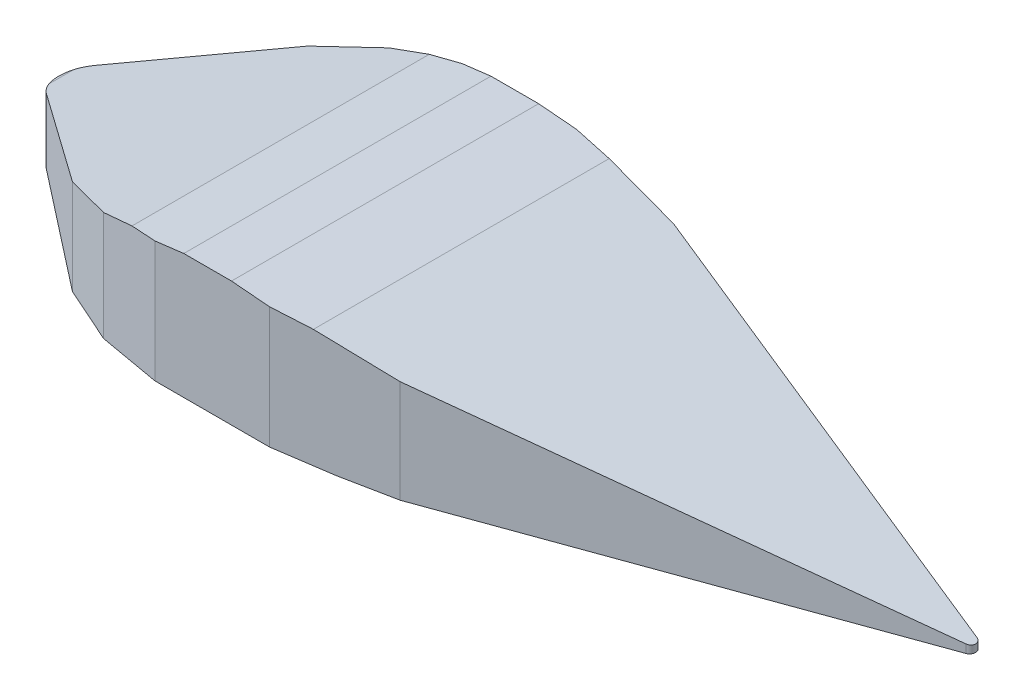
ISO-10303-21;
HEADER;
FILE_DESCRIPTION(('STEP AP214'),'2;1');
FILE_NAME('part.step','',(''),(''),'','','');
FILE_SCHEMA(('AUTOMOTIVE_DESIGN { 1 0 10303 214 1 1 1 1 }'));
ENDSEC;
DATA;
#1=APPLICATION_CONTEXT('core data for automotive mechanical design processes');
#2=APPLICATION_PROTOCOL_DEFINITION('international standard','automotive_design',2000,#1);
#3=PRODUCT_CONTEXT('',#1,'mechanical');
#4=PRODUCT('Part','Part','',(#3));
#5=PRODUCT_RELATED_PRODUCT_CATEGORY('part','',(#4));
#6=PRODUCT_DEFINITION_FORMATION('','',#4);
#7=PRODUCT_DEFINITION_CONTEXT('part definition',#1,'design');
#8=PRODUCT_DEFINITION('design','',#6,#7);
#9=PRODUCT_DEFINITION_SHAPE('','',#8);
#10=(LENGTH_UNIT() NAMED_UNIT(*) SI_UNIT(.MILLI.,.METRE.));
#11=(NAMED_UNIT(*) PLANE_ANGLE_UNIT() SI_UNIT($,.RADIAN.));
#12=(NAMED_UNIT(*) SI_UNIT($,.STERADIAN.) SOLID_ANGLE_UNIT());
#13=UNCERTAINTY_MEASURE_WITH_UNIT(LENGTH_MEASURE(1.E-05),#10,'distance_accuracy_value','');
#14=(GEOMETRIC_REPRESENTATION_CONTEXT(3) GLOBAL_UNCERTAINTY_ASSIGNED_CONTEXT((#13)) GLOBAL_UNIT_ASSIGNED_CONTEXT((#10,
#11,#12)) REPRESENTATION_CONTEXT('',''));
#15=CARTESIAN_POINT('',(0.,0.,0.));
#16=DIRECTION('',(0.,0.,1.));
#17=DIRECTION('',(1.,0.,0.));
#18=AXIS2_PLACEMENT_3D('',#15,#16,#17);
#19=CARTESIAN_POINT('',(1401.451,800.,-800.));
#20=DIRECTION('',(0.,0.,1.));
#21=DIRECTION('',(1.,0.,0.));
#22=AXIS2_PLACEMENT_3D('',#19,#20,#21);
#23=PLANE('',#22);
#24=DIRECTION('',(-0.992522376322293,-0.122062821938327,0.));
#25=VECTOR('',#24,1.);
#26=CARTESIAN_POINT('',(1255.921,763.655,-800.));
#27=LINE('',#26,#25);
#28=CARTESIAN_POINT('',(1551.451,800.,-800.));
#29=VERTEX_POINT('',#28);
#30=CARTESIAN_POINT('',(1401.451,781.55263425033,-800.));
#31=VERTEX_POINT('',#30);
#32=EDGE_CURVE('E665',#29,#31,#27,.T.);
#33=ORIENTED_EDGE('',*,*,#32,.F.);
#34=DIRECTION('',(-1.,0.,0.));
#35=VECTOR('',#34,1.);
#36=CARTESIAN_POINT('',(1401.451,800.,-800.));
#37=LINE('',#36,#35);
#38=CARTESIAN_POINT('',(1800.,800.,-800.));
#39=VERTEX_POINT('',#38);
#40=EDGE_CURVE('E214',#39,#29,#37,.T.);
#41=ORIENTED_EDGE('',*,*,#40,.F.);
#42=DIRECTION('',(-0.996313130885577,0.0857912887476274,0.));
#43=VECTOR('',#42,1.);
#44=CARTESIAN_POINT('',(1800.,800.,-800.));
#45=LINE('',#44,#43);
#46=CARTESIAN_POINT('',(1997.019,783.03493811956,-800.));
#47=VERTEX_POINT('',#46);
#48=EDGE_CURVE('E485',#47,#39,#45,.T.);
#49=ORIENTED_EDGE('',*,*,#48,.F.);
#50=DIRECTION('',(0.,-1.,0.));
#51=VECTOR('',#50,1.);
#52=CARTESIAN_POINT('',(1997.019,800.,-800.));
#53=LINE('',#52,#51);
#54=CARTESIAN_POINT('',(1997.019,150.,-800.));
#55=VERTEX_POINT('',#54);
#56=EDGE_CURVE('E245',#47,#55,#53,.T.);
#57=ORIENTED_EDGE('',*,*,#56,.T.);
#58=DIRECTION('',(1.,0.,0.));
#59=VECTOR('',#58,1.);
#60=CARTESIAN_POINT('',(2301.451,150.,-800.));
#61=LINE('',#60,#59);
#62=CARTESIAN_POINT('',(1401.45099999999,150.,-800.));
#63=VERTEX_POINT('',#62);
#64=EDGE_CURVE('E657',#63,#55,#61,.T.);
#65=ORIENTED_EDGE('',*,*,#64,.F.);
#66=DIRECTION('',(0.,-1.,0.));
#67=VECTOR('',#66,1.);
#68=CARTESIAN_POINT('',(1401.451,800.,-800.));
#69=LINE('',#68,#67);
#70=EDGE_CURVE('E236',#31,#63,#69,.T.);
#71=ORIENTED_EDGE('',*,*,#70,.F.);
#72=EDGE_LOOP('',(#33,#41,#49,#57,#65,#71));
#73=FACE_BOUND('',#72,.T.);
#74=ADVANCED_FACE('F46',(#73),#23,.F.);
#75=CARTESIAN_POINT('',(784.13,800.,-612.54));
#76=DIRECTION('',(0.406737992749078,0.,0.913544856728147));
#77=DIRECTION('',(0.913544856728147,0.,-0.406737992749078));
#78=AXIS2_PLACEMENT_3D('',#75,#76,#77);
#79=PLANE('',#78);
#80=DIRECTION('',(0.913544856728147,0.,-0.406737992749078));
#81=VECTOR('',#80,1.);
#82=CARTESIAN_POINT('',(784.13,150.,-612.54));
#83=LINE('',#82,#81);
#84=CARTESIAN_POINT('',(784.13,150.,-612.54));
#85=VERTEX_POINT('',#84);
#86=CARTESIAN_POINT('',(1076.464,150.,-742.696));
#87=VERTEX_POINT('',#86);
#88=EDGE_CURVE('E401',#85,#87,#83,.T.);
#89=ORIENTED_EDGE('',*,*,#88,.F.);
#90=DIRECTION('',(0.,-1.,0.));
#91=VECTOR('',#90,1.);
#92=CARTESIAN_POINT('',(784.13,800.,-612.54));
#93=LINE('',#92,#91);
#94=CARTESIAN_POINT('',(784.13,645.829431269961,-612.54));
#95=VERTEX_POINT('',#94);
#96=EDGE_CURVE('E284',#95,#85,#93,.T.);
#97=ORIENTED_EDGE('',*,*,#96,.F.);
#98=DIRECTION('',(-0.890658508940707,-0.222433970466134,0.396548293697233));
#99=VECTOR('',#98,1.);
#100=CARTESIAN_POINT('',(814.673148937951,653.457308644519,-626.138740116332));
#101=LINE('',#100,#99);
#102=CARTESIAN_POINT('',(1076.464,718.837224570654,-742.696));
#103=VERTEX_POINT('',#102);
#104=EDGE_CURVE('E220',#103,#95,#101,.T.);
#105=ORIENTED_EDGE('',*,*,#104,.F.);
#106=DIRECTION('',(0.,-1.,0.));
#107=VECTOR('',#106,1.);
#108=CARTESIAN_POINT('',(1076.464,800.,-742.696));
#109=LINE('',#108,#107);
#110=EDGE_CURVE('E228',#103,#87,#109,.T.);
#111=ORIENTED_EDGE('',*,*,#110,.T.);
#112=EDGE_LOOP('',(#89,#97,#105,#111));
#113=FACE_BOUND('',#112,.T.);
#114=ADVANCED_FACE('F48',(#113),#79,.F.);
#115=CARTESIAN_POINT('',(161.409759474516,800.,-126.088702215857));
#116=DIRECTION('',(0.615605620682322,0.,0.788054388849103));
#117=DIRECTION('',(0.788054388849103,0.,-0.615605620682322));
#118=AXIS2_PLACEMENT_3D('',#115,#116,#117);
#119=PLANE('',#118);
#120=DIRECTION('',(0.788054388849103,0.,-0.615605620682322));
#121=VECTOR('',#120,1.);
#122=CARTESIAN_POINT('',(161.409759474516,150.,-126.088702215857));
#123=LINE('',#122,#121);
#124=CARTESIAN_POINT('',(161.409759474516,150.,-126.088702215857));
#125=VERTEX_POINT('',#124);
#126=EDGE_CURVE('E406',#125,#85,#123,.T.);
#127=ORIENTED_EDGE('',*,*,#126,.F.);
#128=DIRECTION('',(0.,-1.,0.));
#129=VECTOR('',#128,1.);
#130=CARTESIAN_POINT('',(161.409759474516,800.,-126.088702215857));
#131=LINE('',#130,#129);
#132=CARTESIAN_POINT('',(161.409759474516,490.310639051325,-126.088702215857));
#133=VERTEX_POINT('',#132);
#134=EDGE_CURVE('E281',#133,#125,#131,.T.);
#135=ORIENTED_EDGE('',*,*,#134,.F.);
#136=DIRECTION('',(-0.773221678679863,-0.193105175903845,0.604018730387262));
#137=VECTOR('',#136,1.);
#138=CARTESIAN_POINT('',(207.650440557195,501.858834220438,-162.210603929074));
#139=LINE('',#138,#137);
#140=EDGE_CURVE('E484',#95,#133,#139,.T.);
#141=ORIENTED_EDGE('',*,*,#140,.F.);
#142=ORIENTED_EDGE('',*,*,#96,.T.);
#143=EDGE_LOOP('',(#127,#135,#141,#142));
#144=FACE_BOUND('',#143,.T.);
#145=ADVANCED_FACE('F373',(#144),#119,.F.);
#146=CARTESIAN_POINT('',(259.906658783687,800.,0.));
#147=DIRECTION('',(0.,-1.,0.));
#148=DIRECTION('',(0.,0.,-1.));
#149=AXIS2_PLACEMENT_3D('',#146,#147,#148);
#150=CYLINDRICAL_SURFACE('',#149,160.);
#151=CARTESIAN_POINT('',(259.906658783687,150.,0.));
#152=DIRECTION('',(0.,-1.,0.));
#153=DIRECTION('',(0.,0.,-1.));
#154=AXIS2_PLACEMENT_3D('',#151,#152,#153);
#155=CIRCLE('',#154,160.);
#156=CARTESIAN_POINT('',(150.000000000001,150.,-116.277798203296));
#157=VERTEX_POINT('',#156);
#158=EDGE_CURVE('E408',#157,#125,#155,.T.);
#159=ORIENTED_EDGE('',*,*,#158,.F.);
#160=CARTESIAN_POINT('',(150.000000000001,150.,116.277798203296));
#161=CARTESIAN_POINT('',(149.197227518989,150.000000444739,115.519013001235));
#162=CARTESIAN_POINT('',(148.402349323818,150.006444551494,114.751945115754));
#163=CARTESIAN_POINT('',(146.828761077163,150.031461689993,113.201629596887));
#164=CARTESIAN_POINT('',(146.050050642099,150.050034433644,112.418382348238));
#165=CARTESIAN_POINT('',(143.738992605804,150.122798834219,110.04521254094));
#166=CARTESIAN_POINT('',(142.231396084721,150.194037269926,108.43155736251));
#167=CARTESIAN_POINT('',(139.286546373213,150.375814699117,105.145862331909));
#168=CARTESIAN_POINT('',(137.849239225862,150.486322991144,103.473869007217));
#169=CARTESIAN_POINT('',(135.046053340974,150.740627964951,100.073395601841));
#170=CARTESIAN_POINT('',(133.680177219111,150.884425864692,98.3449134563995));
#171=CARTESIAN_POINT('',(131.02300306583,151.199252798717,94.8358771461096));
#172=CARTESIAN_POINT('',(129.731654200361,151.37026296545,93.0553597529596));
#173=CARTESIAN_POINT('',(127.224251842487,151.733785604688,89.4439038255724));
#174=CARTESIAN_POINT('',(126.008207640174,151.926300722009,87.6129591103741));
#175=CARTESIAN_POINT('',(123.653075843413,152.327163170553,83.9034496690219));
#176=CARTESIAN_POINT('',(122.514002675644,152.535513454298,82.0248761060327));
#177=CARTESIAN_POINT('',(120.314753352958,152.962451132073,78.2235331504458));
#178=CARTESIAN_POINT('',(119.254568306852,153.181037367909,76.3007687705009));
#179=CARTESIAN_POINT('',(117.216364660646,153.622684269366,72.4173979297616));
#180=CARTESIAN_POINT('',(116.238193444443,153.84573562226,70.4568704991597));
#181=CARTESIAN_POINT('',(114.363161419552,154.291577394139,66.4972847107506));
#182=CARTESIAN_POINT('',(113.466300511938,154.514367813441,64.498226399826));
#183=CARTESIAN_POINT('',(111.755279479412,154.954759642745,60.4646006807219));
#184=CARTESIAN_POINT('',(110.941114441265,155.172361360436,58.4300353905561));
#185=CARTESIAN_POINT('',(109.396721623775,155.597730716471,54.3282724139932));
#186=CARTESIAN_POINT('',(108.666493845212,155.805498354724,52.2610747272925));
#187=CARTESIAN_POINT('',(107.291517437633,156.206751675774,48.0980446572107));
#188=CARTESIAN_POINT('',(106.646732773703,156.400243363975,46.002224759014));
#189=CARTESIAN_POINT('',(105.443470641596,156.769026649784,41.7843631491049));
#190=CARTESIAN_POINT('',(104.884993033116,156.944318276979,39.6623214800256));
#191=CARTESIAN_POINT('',(103.855447732851,157.273084547455,35.3954250788465));
#192=CARTESIAN_POINT('',(103.384381074604,157.426558932767,33.2505700773214));
#193=CARTESIAN_POINT('',(102.530668116976,157.708522147084,28.9416891731521));
#194=CARTESIAN_POINT('',(102.148022100941,157.837010896023,26.7776632090972));
#195=CARTESIAN_POINT('',(101.465667462758,158.068499170636,22.3934355301932));
#196=CARTESIAN_POINT('',(101.16765188495,158.170974528566,20.1729421971747));
#197=CARTESIAN_POINT('',(100.665032437988,158.345025688777,15.7201891996206));
#198=CARTESIAN_POINT('',(100.460428869546,158.416601391587,13.4879294972302));
#199=CARTESIAN_POINT('',(100.145158117363,158.527307591483,9.01595322708889));
#200=CARTESIAN_POINT('',(100.034491923749,158.566437746585,6.77623658098936));
#201=CARTESIAN_POINT('',(99.9073913706491,158.611403854638,2.29379848782876));
#202=CARTESIAN_POINT('',(99.8909568527162,158.617239863573,0.051077045826518));
#203=CARTESIAN_POINT('',(99.9523649444746,158.595490600866,-4.43306367901725));
#204=CARTESIAN_POINT('',(100.030213962676,158.567903057404,-6.67448286298269));
#205=CARTESIAN_POINT('',(100.279994263522,158.479900598214,-11.1514286514722));
#206=CARTESIAN_POINT('',(100.451925825091,158.419485585162,-13.3869552385069));
#207=CARTESIAN_POINT('',(100.889419452544,158.267136953808,-17.8476868417839));
#208=CARTESIAN_POINT('',(101.154979400206,158.175204048558,-20.0728920903795));
#209=CARTESIAN_POINT('',(101.779063595891,157.961800844771,-24.5087784389172));
#210=CARTESIAN_POINT('',(102.137587017684,157.840330808752,-26.7194596677651));
#211=CARTESIAN_POINT('',(102.926775780276,157.577123600622,-31.013612685877));
#212=CARTESIAN_POINT('',(103.353010132429,157.436681731273,-33.0979803235239));
#213=CARTESIAN_POINT('',(104.287844992139,157.134188084224,-37.2465553021804));
#214=CARTESIAN_POINT('',(104.796444743854,156.972136504832,-39.3107628280092));
#215=CARTESIAN_POINT('',(105.895018848793,156.629565097021,-43.4157709760834));
#216=CARTESIAN_POINT('',(106.484990458811,156.449045891235,-45.456572384884));
#217=CARTESIAN_POINT('',(107.745269602171,156.073038938233,-49.5118169088476));
#218=CARTESIAN_POINT('',(108.415577358716,155.87755114943,-51.5262599507603));
#219=CARTESIAN_POINT('',(109.835448832084,155.475423435206,-55.5259909350782));
#220=CARTESIAN_POINT('',(110.585016389714,155.268782969582,-57.5112774592898));
#221=CARTESIAN_POINT('',(112.162222998921,154.848463183412,-61.449830452093));
#222=CARTESIAN_POINT('',(112.989862077778,154.634783860406,-63.4030969094954));
#223=CARTESIAN_POINT('',(114.722056314859,154.204722154663,-67.2750290342799));
#224=CARTESIAN_POINT('',(115.626615162842,153.988339642681,-69.1936930364624));
#225=CARTESIAN_POINT('',(117.511377819577,153.557438268491,-72.9937124329083));
#226=CARTESIAN_POINT('',(118.491581457163,153.342919402067,-74.8750679115794));
#227=CARTESIAN_POINT('',(120.50777368734,152.924342060301,-78.5639102097275));
#228=CARTESIAN_POINT('',(121.542417530248,152.72016412512,-80.3721185349167));
#229=CARTESIAN_POINT('',(123.6821993027,152.32279256364,-83.9478298250324));
#230=CARTESIAN_POINT('',(124.787344283253,152.129600039688,-85.71532869436));
#231=CARTESIAN_POINT('',(127.066448812287,151.759031112758,-89.2066346063972));
#232=CARTESIAN_POINT('',(128.240395586125,151.581651789015,-90.9304496754102));
#233=CARTESIAN_POINT('',(130.655656175891,151.247580067016,-94.3320138856592));
#234=CARTESIAN_POINT('',(131.896962496125,151.090885373631,-96.0097681213313));
#235=CARTESIAN_POINT('',(134.446592080054,150.803019950715,-99.3183641400929));
#236=CARTESIAN_POINT('',(135.754977031147,150.671873267667,-100.949160506855));
#237=CARTESIAN_POINT('',(138.435759352656,150.44038541193,-104.159463428637));
#238=CARTESIAN_POINT('',(139.808154676331,150.340043255038,-105.73897162087));
#239=CARTESIAN_POINT('',(142.615869629207,150.1752575045,-108.845099188879));
#240=CARTESIAN_POINT('',(144.051233647807,150.110839688822,-110.371679851087));
#241=CARTESIAN_POINT('',(146.981580403563,150.023207631752,-113.368082399426));
#242=CARTESIAN_POINT('',(148.476570551278,149.999998528351,-114.83789718552));
#243=CARTESIAN_POINT('',(150.000000000001,150.,-116.277798203296));
#244=B_SPLINE_CURVE_WITH_KNOTS('',3,(#160,#161,#162,#163,#164,#165,#166,#167,#168,#169,#170,
#171,#172,#173,#174,#175,#176,#177,#178,#179,#180,#181,#182,#183,#184,#185,#186,#187,#188,#189,
#190,#191,#192,#193,#194,#195,#196,#197,#198,#199,#200,#201,#202,#203,#204,#205,#206,#207,#208,
#209,#210,#211,#212,#213,#214,#215,#216,#217,#218,#219,#220,#221,#222,#223,#224,#225,#226,#227,
#228,#229,#230,#231,#232,#233,#234,#235,#236,#237,#238,#239,#240,#241,#242,#243),.UNSPECIFIED.,
.F.,.F.,(4,2,2,2,2,2,2,2,2,2,2,2,2,2,2,2,2,2,2,2,2,2,2,2,2,2,2,2,2,2,2,2,2,2,2,2,2,2,2,2,2,4),
(0.,3.31371001652173,6.6273413252177,13.2532751900696,19.8740402078592,26.4950474965281,
33.1114839710404,39.728735074476,46.347223028574,52.9649639039096,59.5701033647876,
66.1752347893619,72.7799735513202,79.3847123747203,85.9866567792445,92.588590451293,
99.190602178882,105.792635062469,112.518689760156,119.244766110194,125.970913354142,
132.697049288266,139.42364242767,146.150255509359,152.876716419738,159.603117549501,
165.997719115792,172.392262004003,178.786589372256,185.180934506686,191.575589643311,
197.970247014478,204.3652113037,210.76016112315,217.038388778441,223.317245323713,
229.59493972496,235.871936978217,242.154814065332,248.437490393973,254.724669155171,
261.012631760362),.UNSPECIFIED.);
#245=CARTESIAN_POINT('',(150.000000000001,150.,116.277798203296));
#246=VERTEX_POINT('',#245);
#247=EDGE_CURVE('E12',#246,#157,#244,.T.);
#248=ORIENTED_EDGE('',*,*,#247,.F.);
#249=CARTESIAN_POINT('',(161.409759474516,150.,126.088702215857));
#250=VERTEX_POINT('',#249);
#251=EDGE_CURVE('E382',#250,#246,#155,.T.);
#252=ORIENTED_EDGE('',*,*,#251,.F.);
#253=DIRECTION('',(0.,-1.,0.));
#254=VECTOR('',#253,1.);
#255=CARTESIAN_POINT('',(161.409759474516,800.,126.088702215857));
#256=LINE('',#255,#254);
#257=CARTESIAN_POINT('',(161.409759474516,490.310639051325,126.088702215857));
#258=VERTEX_POINT('',#257);
#259=EDGE_CURVE('E280',#258,#250,#256,.T.);
#260=ORIENTED_EDGE('',*,*,#259,.F.);
#261=CARTESIAN_POINT('',(259.906658783687,514.909355812027,0.));
#262=DIRECTION('',(-0.242299141310606,0.970201590454346,0.));
#263=DIRECTION('',(-0.970201590454346,-0.242299141310606,0.));
#264=AXIS2_PLACEMENT_3D('',#261,#262,#263);
#265=ELLIPSE('',#264,164.914180283988,160.);
#266=CARTESIAN_POINT('',(113.655128803409,478.384348557619,64.8882884535251));
#267=VERTEX_POINT('',#266);
#268=EDGE_CURVE('E400',#267,#258,#265,.T.);
#269=ORIENTED_EDGE('',*,*,#268,.F.);
#270=CARTESIAN_POINT('',(113.655128803409,478.384348557619,-64.8882884535262));
#271=CARTESIAN_POINT('',(112.773939032918,478.164232994411,-62.9022135519064));
#272=CARTESIAN_POINT('',(111.933155729284,477.945795953747,-60.8980057661391));
#273=CARTESIAN_POINT('',(110.333625202496,477.516710712539,-56.8562236105315));
#274=CARTESIAN_POINT('',(109.574880662755,477.306062766917,-54.8186481517732));
#275=CARTESIAN_POINT('',(108.140474526136,476.896935722458,-50.7124900371555));
#276=CARTESIAN_POINT('',(107.464840130629,476.698460618308,-48.6438974768202));
#277=CARTESIAN_POINT('',(106.198137658814,476.317814583301,-44.4795123289952));
#278=CARTESIAN_POINT('',(105.607068680471,476.135643478542,-42.3837200318979));
#279=CARTESIAN_POINT('',(104.511164120193,475.791492586405,-38.170326894472));
#280=CARTESIAN_POINT('',(104.006242210099,475.629492630005,-36.0527501682851));
#281=CARTESIAN_POINT('',(103.082932209994,475.328755377082,-31.7971598743901));
#282=CARTESIAN_POINT('',(102.66454431668,475.190018133439,-29.6591462602389));
#283=CARTESIAN_POINT('',(101.915268820844,474.938644041753,-25.3666448290491));
#284=CARTESIAN_POINT('',(101.58436782491,474.826003198927,-23.2121595856825));
#285=CARTESIAN_POINT('',(101.010740244002,474.629088177567,-18.8901866979925));
#286=CARTESIAN_POINT('',(100.768013552683,474.544813964819,-16.7226990693543));
#287=CARTESIAN_POINT('',(100.37076423608,474.406161867699,-12.3726224328995));
#288=CARTESIAN_POINT('',(100.21648827366,474.351867603903,-10.1900082088244));
#289=CARTESIAN_POINT('',(99.9975671230744,474.274653761924,-5.8197269539753));
#290=CARTESIAN_POINT('',(99.9329221235671,474.251734249778,-3.63205991257581));
#291=CARTESIAN_POINT('',(99.8934242819723,474.237742403755,0.744450738233989));
#292=CARTESIAN_POINT('',(99.9185822486836,474.246673903504,2.93329445756778));
#293=CARTESIAN_POINT('',(100.05865020922,474.296207977458,7.30773390133306));
#294=CARTESIAN_POINT('',(100.173559683034,474.336810368165,9.49332964450948));
#295=CARTESIAN_POINT('',(100.492693380218,474.448796061191,13.8551440212281));
#296=CARTESIAN_POINT('',(100.696834271621,474.520150643601,16.0313694952312));
#297=CARTESIAN_POINT('',(101.193919943739,474.692171407193,20.3725274347643));
#298=CARTESIAN_POINT('',(101.486866629951,474.792838217324,22.5374596569623));
#299=CARTESIAN_POINT('',(102.16078590948,475.021392150112,26.8515295793954));
#300=CARTESIAN_POINT('',(102.541734866669,475.149271963028,29.0006713610749));
#301=CARTESIAN_POINT('',(103.390811659426,475.429645345374,33.2798357862657));
#302=CARTESIAN_POINT('',(103.8589325439,475.582136952128,35.4098599400322));
#303=CARTESIAN_POINT('',(104.936939869616,475.926381416005,39.8776210107061));
#304=CARTESIAN_POINT('',(105.556701493798,476.120599632764,42.2127912998076));
#305=CARTESIAN_POINT('',(106.900536974426,476.5305848942,46.8503359801782));
#306=CARTESIAN_POINT('',(107.624586121608,476.746346830732,49.1527179985066));
#307=CARTESIAN_POINT('',(109.174416422244,477.193713901137,53.7177097487012));
#308=CARTESIAN_POINT('',(110.000046911566,477.425295350108,55.980372828677));
#309=CARTESIAN_POINT('',(111.314153213711,477.78033591011,59.3440574899914));
#310=CARTESIAN_POINT('',(111.764862264654,477.899976882307,60.4603772225235));
#311=CARTESIAN_POINT('',(112.691287391965,478.141029180627,62.6823991134768));
#312=CARTESIAN_POINT('',(113.167003475439,478.262440507252,63.7881012688804));
#313=CARTESIAN_POINT('',(113.655128803409,478.384348557619,64.8882884535262));
#314=B_SPLINE_CURVE_WITH_KNOTS('',3,(#270,#271,#272,#273,#274,#275,#276,#277,#278,#279,#280,
#281,#282,#283,#284,#285,#286,#287,#288,#289,#290,#291,#292,#293,#294,#295,#296,#297,#298,#299,
#300,#301,#302,#303,#304,#305,#306,#307,#308,#309,#310,#311,#312,#313),.UNSPECIFIED.,.F.,.F.,(4,
2,2,2,2,2,2,2,2,2,2,2,2,2,2,2,2,2,2,2,2,4),(0.,6.55129299468969,13.1028002115111,
19.6564460177392,26.2100219127685,32.7569913826109,39.3039757340479,45.849957223369,
52.395930817664,58.9600714939325,65.5242259865693,72.0891705757979,78.654077128723,
85.2128658627704,91.7717953380147,98.3289652243588,104.885612465355,112.154383970393,
119.421436080517,126.677836867381,130.306981102657,133.936126369311),.UNSPECIFIED.);
#315=CARTESIAN_POINT('',(113.655128803409,478.384348557619,-64.8882884535256));
#316=VERTEX_POINT('',#315);
#317=EDGE_CURVE('E61',#316,#267,#314,.T.);
#318=ORIENTED_EDGE('',*,*,#317,.F.);
#319=EDGE_CURVE('E397',#133,#316,#265,.T.);
#320=ORIENTED_EDGE('',*,*,#319,.F.);
#321=ORIENTED_EDGE('',*,*,#134,.T.);
#322=EDGE_LOOP('',(#159,#248,#252,#260,#269,#318,#320,#321));
#323=FACE_BOUND('',#322,.T.);
#324=ADVANCED_FACE('F315',(#323),#150,.T.);
#325=CARTESIAN_POINT('',(784.13,800.,612.54));
#326=DIRECTION('',(0.615605620682322,0.,-0.788054388849103));
#327=DIRECTION('',(-0.788054388849103,0.,-0.615605620682322));
#328=AXIS2_PLACEMENT_3D('',#325,#326,#327);
#329=PLANE('',#328);
#330=DIRECTION('',(-0.788054388849103,0.,-0.615605620682322));
#331=VECTOR('',#330,1.);
#332=CARTESIAN_POINT('',(784.13,150.,612.54));
#333=LINE('',#332,#331);
#334=CARTESIAN_POINT('',(784.13,150.,612.54));
#335=VERTEX_POINT('',#334);
#336=EDGE_CURVE('E380',#335,#250,#333,.T.);
#337=ORIENTED_EDGE('',*,*,#336,.F.);
#338=DIRECTION('',(0.,-1.,0.));
#339=VECTOR('',#338,1.);
#340=CARTESIAN_POINT('',(784.13,800.,612.54));
#341=LINE('',#340,#339);
#342=CARTESIAN_POINT('',(784.13,645.82943126996,612.54));
#343=VERTEX_POINT('',#342);
#344=EDGE_CURVE('E272',#343,#335,#341,.T.);
#345=ORIENTED_EDGE('',*,*,#344,.F.);
#346=DIRECTION('',(0.773221678679863,0.193105175903845,0.604018730387262));
#347=VECTOR('',#346,1.);
#348=CARTESIAN_POINT('',(807.149686821474,651.578391491176,630.522323040345));
#349=LINE('',#348,#347);
#350=EDGE_CURVE('E395',#258,#343,#349,.T.);
#351=ORIENTED_EDGE('',*,*,#350,.F.);
#352=ORIENTED_EDGE('',*,*,#259,.T.);
#353=EDGE_LOOP('',(#337,#345,#351,#352));
#354=FACE_BOUND('',#353,.T.);
#355=ADVANCED_FACE('F368',(#354),#329,.F.);
#356=CARTESIAN_POINT('',(1076.464,800.,742.696));
#357=DIRECTION('',(0.406737992749078,0.,-0.913544856728147));
#358=DIRECTION('',(-0.913544856728147,0.,-0.406737992749078));
#359=AXIS2_PLACEMENT_3D('',#356,#357,#358);
#360=PLANE('',#359);
#361=DIRECTION('',(-0.913544856728147,0.,-0.406737992749078));
#362=VECTOR('',#361,1.);
#363=CARTESIAN_POINT('',(1076.464,150.,742.696));
#364=LINE('',#363,#362);
#365=CARTESIAN_POINT('',(1076.464,150.,742.696));
#366=VERTEX_POINT('',#365);
#367=EDGE_CURVE('E383',#366,#335,#364,.T.);
#368=ORIENTED_EDGE('',*,*,#367,.F.);
#369=DIRECTION('',(0.,-1.,0.));
#370=VECTOR('',#369,1.);
#371=CARTESIAN_POINT('',(1076.464,800.,742.696));
#372=LINE('',#371,#370);
#373=CARTESIAN_POINT('',(1076.464,718.837224570654,742.696));
#374=VERTEX_POINT('',#373);
#375=EDGE_CURVE('E267',#374,#366,#372,.T.);
#376=ORIENTED_EDGE('',*,*,#375,.F.);
#377=DIRECTION('',(0.890658508940707,0.222433970466134,0.396548293697233));
#378=VECTOR('',#377,1.);
#379=CARTESIAN_POINT('',(1092.5433772675,722.852904758212,749.85502846617));
#380=LINE('',#379,#378);
#381=EDGE_CURVE('E386',#343,#374,#380,.T.);
#382=ORIENTED_EDGE('',*,*,#381,.F.);
#383=ORIENTED_EDGE('',*,*,#344,.T.);
#384=EDGE_LOOP('',(#368,#376,#382,#383));
#385=FACE_BOUND('',#384,.T.);
#386=ADVANCED_FACE('F361',(#385),#360,.F.);
#387=CARTESIAN_POINT('',(1401.451,800.,800.));
#388=DIRECTION('',(0.173648246791891,0.,-0.98480774082361));
#389=DIRECTION('',(-0.98480774082361,0.,-0.173648246791891));
#390=AXIS2_PLACEMENT_3D('',#387,#388,#389);
#391=PLANE('',#390);
#392=DIRECTION('',(-0.98480774082361,0.,-0.173648246791891));
#393=VECTOR('',#392,1.);
#394=CARTESIAN_POINT('',(1401.451,150.,800.));
#395=LINE('',#394,#393);
#396=CARTESIAN_POINT('',(1401.451,150.,800.));
#397=VERTEX_POINT('',#396);
#398=EDGE_CURVE('E416',#397,#366,#395,.T.);
#399=ORIENTED_EDGE('',*,*,#398,.F.);
#400=DIRECTION('',(0.,-1.,0.));
#401=VECTOR('',#400,1.);
#402=CARTESIAN_POINT('',(1401.451,800.,800.));
#403=LINE('',#402,#401);
#404=CARTESIAN_POINT('',(1401.451,781.55263425033,800.));
#405=VERTEX_POINT('',#404);
#406=EDGE_CURVE('E266',#405,#397,#403,.T.);
#407=ORIENTED_EDGE('',*,*,#406,.F.);
#408=DIRECTION('',(0.977663361324776,0.120235424042734,0.172388499408761));
#409=VECTOR('',#408,1.);
#410=CARTESIAN_POINT('',(1403.61948357921,781.819319648382,800.382362319179));
#411=LINE('',#410,#409);
#412=CARTESIAN_POINT('',(1255.921,763.655,774.339123964959));
#413=VERTEX_POINT('',#412);
#414=EDGE_CURVE('E199',#413,#405,#411,.T.);
#415=ORIENTED_EDGE('',*,*,#414,.F.);
#416=DIRECTION('',(0.956308883695465,0.238829562460936,0.168623127298276));
#417=VECTOR('',#416,1.);
#418=CARTESIAN_POINT('',(1401.45104302586,799.999822361657,800.000007586622));
#419=LINE('',#418,#417);
#420=EDGE_CURVE('E392',#374,#413,#419,.T.);
#421=ORIENTED_EDGE('',*,*,#420,.F.);
#422=ORIENTED_EDGE('',*,*,#375,.T.);
#423=EDGE_LOOP('',(#399,#407,#415,#421,#422));
#424=FACE_BOUND('',#423,.T.);
#425=ADVANCED_FACE('F360',(#424),#391,.F.);
#426=CARTESIAN_POINT('',(2590.582,800.,712.35));
#427=DIRECTION('',(-0.146083423120088,0.,-0.989272274699699));
#428=DIRECTION('',(-0.989272274699699,0.,0.146083423120088));
#429=AXIS2_PLACEMENT_3D('',#426,#427,#428);
#430=PLANE('',#429);
#431=DIRECTION('',(0.985702371591284,-0.0848776094170749,-0.145556264238128));
#432=VECTOR('',#431,1.);
#433=CARTESIAN_POINT('',(2584.88648237212,732.414397887696,713.191043191849));
#434=LINE('',#433,#432);
#435=CARTESIAN_POINT('',(1997.019,783.03493811956,800.));
#436=VERTEX_POINT('',#435);
#437=CARTESIAN_POINT('',(2197.056,765.81,770.461024272065));
#438=VERTEX_POINT('',#437);
#439=EDGE_CURVE('E223',#436,#438,#434,.T.);
#440=ORIENTED_EDGE('',*,*,#439,.F.);
#441=DIRECTION('',(0.,-1.,0.));
#442=VECTOR('',#441,1.);
#443=CARTESIAN_POINT('',(1997.019,800.,800.));
#444=LINE('',#443,#442);
#445=CARTESIAN_POINT('',(1997.019,150.,800.));
#446=VERTEX_POINT('',#445);
#447=EDGE_CURVE('E265',#436,#446,#444,.T.);
#448=ORIENTED_EDGE('',*,*,#447,.T.);
#449=DIRECTION('',(-0.989272274699699,0.,0.146083423120088));
#450=VECTOR('',#449,1.);
#451=CARTESIAN_POINT('',(2590.582,150.,712.35));
#452=LINE('',#451,#450);
#453=CARTESIAN_POINT('',(2301.451,150.,755.045269331141));
#454=VERTEX_POINT('',#453);
#455=EDGE_CURVE('E414',#454,#446,#452,.T.);
#456=ORIENTED_EDGE('',*,*,#455,.F.);
#457=DIRECTION('',(-0.988350774373105,-0.0431522719975946,0.14594734741519));
#458=VECTOR('',#457,1.);
#459=CARTESIAN_POINT('',(2617.76583173237,163.810586291539,708.335829892796));
#460=LINE('',#459,#458);
#461=CARTESIAN_POINT('',(2590.582,162.623716071706,712.35));
#462=VERTEX_POINT('',#461);
#463=EDGE_CURVE('E432',#462,#454,#460,.T.);
#464=ORIENTED_EDGE('',*,*,#463,.F.);
#465=DIRECTION('',(0.,-1.,0.));
#466=VECTOR('',#465,1.);
#467=CARTESIAN_POINT('',(2590.582,800.,712.35));
#468=LINE('',#467,#466);
#469=CARTESIAN_POINT('',(2590.582,697.531921597388,712.35));
#470=VERTEX_POINT('',#469);
#471=EDGE_CURVE('E256',#470,#462,#468,.T.);
#472=ORIENTED_EDGE('',*,*,#471,.F.);
#473=DIRECTION('',(0.97501408555577,-0.169168207887732,-0.143977951117174));
#474=VECTOR('',#473,1.);
#475=CARTESIAN_POINT('',(2573.68077317683,700.464341031258,714.845762928368));
#476=LINE('',#475,#474);
#477=EDGE_CURVE('E231',#438,#470,#476,.T.);
#478=ORIENTED_EDGE('',*,*,#477,.F.);
#479=EDGE_LOOP('',(#440,#448,#456,#464,#472,#478));
#480=FACE_BOUND('',#479,.T.);
#481=ADVANCED_FACE('F352',(#480),#430,.F.);
#482=CARTESIAN_POINT('',(4854.87610310538,800.,28.719585911815));
#483=DIRECTION('',(-0.289031688101065,0.,-0.957319530393822));
#484=DIRECTION('',(-0.957319530393822,0.,0.289031688101065));
#485=AXIS2_PLACEMENT_3D('',#482,#483,#484);
#486=PLANE('',#485);
#487=DIRECTION('',(0.944381088750944,-0.163853280392353,-0.285125343865197));
#488=VECTOR('',#487,1.);
#489=CARTESIAN_POINT('',(4778.22866289039,317.967902025511,51.8608029565039));
#490=LINE('',#489,#488);
#491=CARTESIAN_POINT('',(4854.87610310538,304.669314556428,28.719585911815));
#492=VERTEX_POINT('',#491);
#493=EDGE_CURVE('E445',#470,#492,#490,.T.);
#494=ORIENTED_EDGE('',*,*,#493,.F.);
#495=ORIENTED_EDGE('',*,*,#471,.T.);
#496=DIRECTION('',(-0.956484394223131,-0.0417609575579589,0.288779545729009));
#497=VECTOR('',#496,1.);
#498=CARTESIAN_POINT('',(4876.38639470797,262.423964658853,22.2252486544476));
#499=LINE('',#498,#497);
#500=CARTESIAN_POINT('',(4854.87610310538,261.484806236509,28.719585911815));
#501=VERTEX_POINT('',#500);
#502=EDGE_CURVE('E431',#501,#462,#499,.T.);
#503=ORIENTED_EDGE('',*,*,#502,.F.);
#504=DIRECTION('',(0.,-1.,0.));
#505=VECTOR('',#504,1.);
#506=CARTESIAN_POINT('',(4854.87610310538,800.,28.719585911815));
#507=LINE('',#506,#505);
#508=EDGE_CURVE('E255',#492,#501,#507,.T.);
#509=ORIENTED_EDGE('',*,*,#508,.F.);
#510=EDGE_LOOP('',(#494,#495,#503,#509));
#511=FACE_BOUND('',#510,.T.);
#512=ADVANCED_FACE('F349',(#511),#486,.F.);
#513=CARTESIAN_POINT('',(4846.20515246235,800.,0.));
#514=DIRECTION('',(0.,-1.,0.));
#515=DIRECTION('',(0.,0.,-1.));
#516=AXIS2_PLACEMENT_3D('',#513,#514,#515);
#517=CYLINDRICAL_SURFACE('',#516,30.0000000000002);
#518=CARTESIAN_POINT('',(4846.20515246235,306.173753520639,0.));
#519=DIRECTION('',(0.170949346923816,0.985279818521785,0.));
#520=DIRECTION('',(0.985279818521785,-0.170949346923816,0.));
#521=AXIS2_PLACEMENT_3D('',#518,#519,#520);
#522=ELLIPSE('',#521,30.448203074949,30.0000000000002);
#523=CARTESIAN_POINT('',(4854.87610310538,304.669314556428,-28.7195859118151));
#524=VERTEX_POINT('',#523);
#525=EDGE_CURVE('E438',#492,#524,#522,.T.);
#526=ORIENTED_EDGE('',*,*,#525,.F.);
#527=ORIENTED_EDGE('',*,*,#508,.T.);
#528=CARTESIAN_POINT('',(4846.20515246235,261.106224835727,0.));
#529=DIRECTION('',(0.0436193321422773,-0.999048223992947,0.));
#530=DIRECTION('',(-0.999048223992947,-0.0436193321422773,0.));
#531=AXIS2_PLACEMENT_3D('',#528,#529,#530);
#532=ELLIPSE('',#531,30.0285804824292,30.0000000000002);
#533=CARTESIAN_POINT('',(4854.87610310538,261.484806236509,-28.7195859118152));
#534=VERTEX_POINT('',#533);
#535=EDGE_CURVE('E428',#534,#501,#532,.T.);
#536=ORIENTED_EDGE('',*,*,#535,.F.);
#537=DIRECTION('',(0.,-1.,0.));
#538=VECTOR('',#537,1.);
#539=CARTESIAN_POINT('',(4854.87610310538,800.,-28.719585911815));
#540=LINE('',#539,#538);
#541=EDGE_CURVE('E249',#524,#534,#540,.T.);
#542=ORIENTED_EDGE('',*,*,#541,.F.);
#543=EDGE_LOOP('',(#526,#527,#536,#542));
#544=FACE_BOUND('',#543,.T.);
#545=ADVANCED_FACE('F344',(#544),#517,.T.);
#546=CARTESIAN_POINT('',(2590.582,800.,-712.35));
#547=DIRECTION('',(-0.289031688101065,0.,0.957319530393822));
#548=DIRECTION('',(0.957319530393822,0.,0.289031688101065));
#549=AXIS2_PLACEMENT_3D('',#546,#547,#548);
#550=PLANE('',#549);
#551=DIRECTION('',(-0.944381088750944,0.163853280392353,-0.285125343865197));
#552=VECTOR('',#551,1.);
#553=CARTESIAN_POINT('',(2574.72609576448,700.282974062885,-717.137177762556));
#554=LINE('',#553,#552);
#555=CARTESIAN_POINT('',(2590.582,697.531921597388,-712.35));
#556=VERTEX_POINT('',#555);
#557=EDGE_CURVE('E68',#524,#556,#554,.T.);
#558=ORIENTED_EDGE('',*,*,#557,.F.);
#559=ORIENTED_EDGE('',*,*,#541,.T.);
#560=DIRECTION('',(0.956484394223131,0.0417609575579589,0.288779545729009));
#561=VECTOR('',#560,1.);
#562=CARTESIAN_POINT('',(2616.04116974423,163.735286018451,-704.663426630084));
#563=LINE('',#562,#561);
#564=CARTESIAN_POINT('',(2590.582,162.623716071706,-712.35));
#565=VERTEX_POINT('',#564);
#566=EDGE_CURVE('E422',#565,#534,#563,.T.);
#567=ORIENTED_EDGE('',*,*,#566,.F.);
#568=DIRECTION('',(0.,-1.,0.));
#569=VECTOR('',#568,1.);
#570=CARTESIAN_POINT('',(2590.582,800.,-712.35));
#571=LINE('',#570,#569);
#572=EDGE_CURVE('E246',#556,#565,#571,.T.);
#573=ORIENTED_EDGE('',*,*,#572,.F.);
#574=EDGE_LOOP('',(#558,#559,#567,#573));
#575=FACE_BOUND('',#574,.T.);
#576=ADVANCED_FACE('F341',(#575),#550,.F.);
#577=CARTESIAN_POINT('',(1997.019,800.,-800.));
#578=DIRECTION('',(-0.146083423120088,0.,0.989272274699699));
#579=DIRECTION('',(0.989272274699699,0.,0.146083423120088));
#580=AXIS2_PLACEMENT_3D('',#577,#578,#579);
#581=PLANE('',#580);
#582=DIRECTION('',(-0.985702371591284,0.0848776094170749,-0.145556264238128));
#583=VECTOR('',#582,1.);
#584=CARTESIAN_POINT('',(1995.59963402971,783.157157963925,-800.209594309781));
#585=LINE('',#584,#583);
#586=CARTESIAN_POINT('',(2197.056,765.81,-770.461024272066));
#587=VERTEX_POINT('',#586);
#588=EDGE_CURVE('E302',#587,#47,#585,.T.);
#589=ORIENTED_EDGE('',*,*,#588,.F.);
#590=DIRECTION('',(-0.97501408555577,0.169168207887732,-0.143977951117174));
#591=VECTOR('',#590,1.);
#592=CARTESIAN_POINT('',(1997.10428940276,800.502291164738,-799.987405521989));
#593=LINE('',#592,#591);
#594=EDGE_CURVE('E301',#556,#587,#593,.T.);
#595=ORIENTED_EDGE('',*,*,#594,.F.);
#596=ORIENTED_EDGE('',*,*,#572,.T.);
#597=DIRECTION('',(0.988350774373105,0.0431522719975946,0.14594734741519));
#598=VECTOR('',#597,1.);
#599=CARTESIAN_POINT('',(2025.30811642221,137.943356618598,-795.822615199386));
#600=LINE('',#599,#598);
#601=CARTESIAN_POINT('',(2301.451,150.,-755.045269331141));
#602=VERTEX_POINT('',#601);
#603=EDGE_CURVE('E297',#602,#565,#600,.T.);
#604=ORIENTED_EDGE('',*,*,#603,.F.);
#605=DIRECTION('',(0.989272274699699,0.,0.146083423120088));
#606=VECTOR('',#605,1.);
#607=CARTESIAN_POINT('',(1997.019,150.,-800.));
#608=LINE('',#607,#606);
#609=EDGE_CURVE('E415',#55,#602,#608,.T.);
#610=ORIENTED_EDGE('',*,*,#609,.F.);
#611=ORIENTED_EDGE('',*,*,#56,.F.);
#612=EDGE_LOOP('',(#589,#595,#596,#604,#610,#611));
#613=FACE_BOUND('',#612,.T.);
#614=ADVANCED_FACE('F331',(#613),#581,.F.);
#615=CARTESIAN_POINT('',(1076.464,800.,-742.696));
#616=DIRECTION('',(0.173648246791891,0.,0.98480774082361));
#617=DIRECTION('',(0.98480774082361,0.,-0.173648246791891));
#618=AXIS2_PLACEMENT_3D('',#615,#616,#617);
#619=PLANE('',#618);
#620=DIRECTION('',(0.98480774082361,0.,-0.173648246791891));
#621=VECTOR('',#620,1.);
#622=CARTESIAN_POINT('',(1076.464,150.,-742.696));
#623=LINE('',#622,#621);
#624=EDGE_CURVE('E293',#87,#63,#623,.T.);
#625=ORIENTED_EDGE('',*,*,#624,.F.);
#626=ORIENTED_EDGE('',*,*,#110,.F.);
#627=DIRECTION('',(-0.956308883695465,-0.238829562460936,0.168623127298276));
#628=VECTOR('',#627,1.);
#629=CARTESIAN_POINT('',(1095.00115848079,723.466713561835,-745.964602527435));
#630=LINE('',#629,#628);
#631=CARTESIAN_POINT('',(1255.921,763.655,-774.339123964959));
#632=VERTEX_POINT('',#631);
#633=EDGE_CURVE('E287',#632,#103,#630,.T.);
#634=ORIENTED_EDGE('',*,*,#633,.F.);
#635=DIRECTION('',(-0.977663361324776,-0.120235424042734,0.172388499408761));
#636=VECTOR('',#635,1.);
#637=CARTESIAN_POINT('',(1083.33067673226,742.429421212174,-743.906780872666));
#638=LINE('',#637,#636);
#639=EDGE_CURVE('E295',#31,#632,#638,.T.);
#640=ORIENTED_EDGE('',*,*,#639,.F.);
#641=ORIENTED_EDGE('',*,*,#70,.T.);
#642=EDGE_LOOP('',(#625,#626,#634,#640,#641));
#643=FACE_BOUND('',#642,.T.);
#644=ADVANCED_FACE('F332',(#643),#619,.F.);
#645=CARTESIAN_POINT('',(4846.20515246235,800.,0.));
#646=DIRECTION('',(0.,-1.,0.));
#647=DIRECTION('',(0.,0.,-1.));
#648=AXIS2_PLACEMENT_3D('',#645,#646,#647);
#649=PLANE('',#648);
#650=DIRECTION('',(0.,0.,1.));
#651=VECTOR('',#650,1.);
#652=CARTESIAN_POINT('',(1800.,800.,-800.));
#653=LINE('',#652,#651);
#654=CARTESIAN_POINT('',(1800.,800.,800.));
#655=VERTEX_POINT('',#654);
#656=EDGE_CURVE('E217',#39,#655,#653,.T.);
#657=ORIENTED_EDGE('',*,*,#656,.F.);
#658=ORIENTED_EDGE('',*,*,#40,.T.);
#659=DIRECTION('',(0.,0.,1.));
#660=VECTOR('',#659,1.);
#661=CARTESIAN_POINT('',(1551.451,800.,-800.));
#662=LINE('',#661,#660);
#663=CARTESIAN_POINT('',(1551.451,800.,800.));
#664=VERTEX_POINT('',#663);
#665=EDGE_CURVE('E197',#29,#664,#662,.T.);
#666=ORIENTED_EDGE('',*,*,#665,.T.);
#667=DIRECTION('',(1.,0.,0.));
#668=VECTOR('',#667,1.);
#669=CARTESIAN_POINT('',(1997.019,800.,800.));
#670=LINE('',#669,#668);
#671=EDGE_CURVE('E213',#664,#655,#670,.T.);
#672=ORIENTED_EDGE('',*,*,#671,.T.);
#673=EDGE_LOOP('',(#657,#658,#666,#672));
#674=FACE_BOUND('',#673,.T.);
#675=ADVANCED_FACE('F215',(#674),#649,.F.);
#676=CARTESIAN_POINT('',(1997.019,800.,800.));
#677=DIRECTION('',(0.,0.,-1.));
#678=DIRECTION('',(-1.,0.,0.));
#679=AXIS2_PLACEMENT_3D('',#676,#677,#678);
#680=PLANE('',#679);
#681=ORIENTED_EDGE('',*,*,#671,.F.);
#682=DIRECTION('',(-0.992522376322293,-0.122062821938327,0.));
#683=VECTOR('',#682,1.);
#684=CARTESIAN_POINT('',(1255.921,763.655,800.));
#685=LINE('',#684,#683);
#686=EDGE_CURVE('E192',#664,#405,#685,.T.);
#687=ORIENTED_EDGE('',*,*,#686,.T.);
#688=ORIENTED_EDGE('',*,*,#406,.T.);
#689=DIRECTION('',(1.,0.,0.));
#690=VECTOR('',#689,1.);
#691=CARTESIAN_POINT('',(2301.451,150.,800.));
#692=LINE('',#691,#690);
#693=EDGE_CURVE('E206',#397,#446,#692,.T.);
#694=ORIENTED_EDGE('',*,*,#693,.T.);
#695=ORIENTED_EDGE('',*,*,#447,.F.);
#696=DIRECTION('',(-0.996313130885577,0.0857912887476274,0.));
#697=VECTOR('',#696,1.);
#698=CARTESIAN_POINT('',(1800.,800.,800.));
#699=LINE('',#698,#697);
#700=EDGE_CURVE('E224',#436,#655,#699,.T.);
#701=ORIENTED_EDGE('',*,*,#700,.T.);
#702=EDGE_LOOP('',(#681,#687,#688,#694,#695,#701));
#703=FACE_BOUND('',#702,.T.);
#704=ADVANCED_FACE('F222',(#703),#680,.F.);
#705=CARTESIAN_POINT('',(113.655128803409,478.384348557619,-800.));
#706=DIRECTION('',(-0.242299141310606,0.970201590454346,0.));
#707=DIRECTION('',(-0.970201590454346,-0.242299141310606,0.));
#708=AXIS2_PLACEMENT_3D('',#705,#706,#707);
#709=PLANE('',#708);
#710=ORIENTED_EDGE('',*,*,#268,.T.);
#711=ORIENTED_EDGE('',*,*,#350,.T.);
#712=ORIENTED_EDGE('',*,*,#381,.T.);
#713=ORIENTED_EDGE('',*,*,#420,.T.);
#714=DIRECTION('',(0.,0.,1.));
#715=VECTOR('',#714,1.);
#716=CARTESIAN_POINT('',(1255.921,763.655,-800.));
#717=LINE('',#716,#715);
#718=EDGE_CURVE('E76',#632,#413,#717,.T.);
#719=ORIENTED_EDGE('',*,*,#718,.F.);
#720=ORIENTED_EDGE('',*,*,#633,.T.);
#721=ORIENTED_EDGE('',*,*,#104,.T.);
#722=ORIENTED_EDGE('',*,*,#140,.T.);
#723=ORIENTED_EDGE('',*,*,#319,.T.);
#724=DIRECTION('',(0.,0.,1.));
#725=VECTOR('',#724,1.);
#726=CARTESIAN_POINT('',(113.655128803409,478.384348557619,-800.));
#727=LINE('',#726,#725);
#728=EDGE_CURVE('E471',#316,#267,#727,.T.);
#729=ORIENTED_EDGE('',*,*,#728,.T.);
#730=EDGE_LOOP('',(#710,#711,#712,#713,#719,#720,#721,#722,#723,#729));
#731=FACE_BOUND('',#730,.T.);
#732=ADVANCED_FACE('F322',(#731),#709,.T.);
#733=CARTESIAN_POINT('',(1255.921,763.655,-800.));
#734=DIRECTION('',(-0.122062821938327,0.992522376322293,0.));
#735=DIRECTION('',(-0.992522376322293,-0.122062821938327,0.));
#736=AXIS2_PLACEMENT_3D('',#733,#734,#735);
#737=PLANE('',#736);
#738=ORIENTED_EDGE('',*,*,#414,.T.);
#739=ORIENTED_EDGE('',*,*,#686,.F.);
#740=ORIENTED_EDGE('',*,*,#665,.F.);
#741=ORIENTED_EDGE('',*,*,#32,.T.);
#742=ORIENTED_EDGE('',*,*,#639,.T.);
#743=ORIENTED_EDGE('',*,*,#718,.T.);
#744=EDGE_LOOP('',(#738,#739,#740,#741,#742,#743));
#745=FACE_BOUND('',#744,.T.);
#746=ADVANCED_FACE('F198',(#745),#737,.T.);
#747=CARTESIAN_POINT('',(150.,332.854109989467,-800.));
#748=DIRECTION('',(0.,0.,1.));
#749=DIRECTION('',(1.,0.,0.));
#750=AXIS2_PLACEMENT_3D('',#747,#748,#749);
#751=CYLINDRICAL_SURFACE('',#750,150.);
#752=ORIENTED_EDGE('',*,*,#317,.T.);
#753=ORIENTED_EDGE('',*,*,#728,.F.);
#754=EDGE_LOOP('',(#752,#753));
#755=FACE_BOUND('',#754,.T.);
#756=ADVANCED_FACE('F312',(#755),#751,.T.);
#757=CARTESIAN_POINT('',(2301.451,150.,-800.));
#758=DIRECTION('',(0.,-1.,0.));
#759=DIRECTION('',(0.,0.,-1.));
#760=AXIS2_PLACEMENT_3D('',#757,#758,#759);
#761=PLANE('',#760);
#762=ORIENTED_EDGE('',*,*,#251,.T.);
#763=DIRECTION('',(0.,0.,1.));
#764=VECTOR('',#763,1.);
#765=CARTESIAN_POINT('',(150.000000000001,150.,-800.));
#766=LINE('',#765,#764);
#767=EDGE_CURVE('E470',#157,#246,#766,.T.);
#768=ORIENTED_EDGE('',*,*,#767,.F.);
#769=ORIENTED_EDGE('',*,*,#158,.T.);
#770=ORIENTED_EDGE('',*,*,#126,.T.);
#771=ORIENTED_EDGE('',*,*,#88,.T.);
#772=ORIENTED_EDGE('',*,*,#624,.T.);
#773=ORIENTED_EDGE('',*,*,#64,.T.);
#774=ORIENTED_EDGE('',*,*,#609,.T.);
#775=DIRECTION('',(0.,0.,1.));
#776=VECTOR('',#775,1.);
#777=CARTESIAN_POINT('',(2301.451,150.,-800.));
#778=LINE('',#777,#776);
#779=EDGE_CURVE('E465',#602,#454,#778,.T.);
#780=ORIENTED_EDGE('',*,*,#779,.T.);
#781=ORIENTED_EDGE('',*,*,#455,.T.);
#782=ORIENTED_EDGE('',*,*,#693,.F.);
#783=ORIENTED_EDGE('',*,*,#398,.T.);
#784=ORIENTED_EDGE('',*,*,#367,.T.);
#785=ORIENTED_EDGE('',*,*,#336,.T.);
#786=EDGE_LOOP('',(#762,#768,#769,#770,#771,#772,#773,#774,#780,#781,#782,#783,#784,#785));
#787=FACE_BOUND('',#786,.T.);
#788=ADVANCED_FACE('F317',(#787),#761,.T.);
#789=CARTESIAN_POINT('',(4950.,265.638,-800.));
#790=DIRECTION('',(0.0436193321422773,-0.999048223992947,0.));
#791=DIRECTION('',(0.999048223992947,0.0436193321422773,0.));
#792=AXIS2_PLACEMENT_3D('',#789,#790,#791);
#793=PLANE('',#792);
#794=ORIENTED_EDGE('',*,*,#463,.T.);
#795=ORIENTED_EDGE('',*,*,#779,.F.);
#796=ORIENTED_EDGE('',*,*,#603,.T.);
#797=ORIENTED_EDGE('',*,*,#566,.T.);
#798=ORIENTED_EDGE('',*,*,#535,.T.);
#799=ORIENTED_EDGE('',*,*,#502,.T.);
#800=EDGE_LOOP('',(#794,#795,#796,#797,#798,#799));
#801=FACE_BOUND('',#800,.T.);
#802=ADVANCED_FACE('F461',(#801),#793,.T.);
#803=CARTESIAN_POINT('',(150.,300.,-800.));
#804=DIRECTION('',(0.,0.,1.));
#805=DIRECTION('',(1.,0.,0.));
#806=AXIS2_PLACEMENT_3D('',#803,#804,#805);
#807=CYLINDRICAL_SURFACE('',#806,150.);
#808=ORIENTED_EDGE('',*,*,#247,.T.);
#809=ORIENTED_EDGE('',*,*,#767,.T.);
#810=EDGE_LOOP('',(#808,#809));
#811=FACE_BOUND('',#810,.T.);
#812=ADVANCED_FACE('F321',(#811),#807,.T.);
#813=CARTESIAN_POINT('',(1800.,800.,-800.));
#814=DIRECTION('',(0.0857912887476274,0.996313130885577,0.));
#815=DIRECTION('',(-0.996313130885577,0.0857912887476274,0.));
#816=AXIS2_PLACEMENT_3D('',#813,#814,#815);
#817=PLANE('',#816);
#818=ORIENTED_EDGE('',*,*,#439,.T.);
#819=DIRECTION('',(0.,0.,1.));
#820=VECTOR('',#819,1.);
#821=CARTESIAN_POINT('',(2197.056,765.81,-800.));
#822=LINE('',#821,#820);
#823=EDGE_CURVE('E451',#587,#438,#822,.T.);
#824=ORIENTED_EDGE('',*,*,#823,.F.);
#825=ORIENTED_EDGE('',*,*,#588,.T.);
#826=ORIENTED_EDGE('',*,*,#48,.T.);
#827=ORIENTED_EDGE('',*,*,#656,.T.);
#828=ORIENTED_EDGE('',*,*,#700,.F.);
#829=EDGE_LOOP('',(#818,#824,#825,#826,#827,#828));
#830=FACE_BOUND('',#829,.T.);
#831=ADVANCED_FACE('F496',(#830),#817,.T.);
#832=CARTESIAN_POINT('',(2197.056,765.81,-800.));
#833=DIRECTION('',(0.170949346923816,0.985279818521785,0.));
#834=DIRECTION('',(-0.985279818521785,0.170949346923816,0.));
#835=AXIS2_PLACEMENT_3D('',#832,#833,#834);
#836=PLANE('',#835);
#837=ORIENTED_EDGE('',*,*,#477,.T.);
#838=ORIENTED_EDGE('',*,*,#493,.T.);
#839=ORIENTED_EDGE('',*,*,#525,.T.);
#840=ORIENTED_EDGE('',*,*,#557,.T.);
#841=ORIENTED_EDGE('',*,*,#594,.T.);
#842=ORIENTED_EDGE('',*,*,#823,.T.);
#843=EDGE_LOOP('',(#837,#838,#839,#840,#841,#842));
#844=FACE_BOUND('',#843,.T.);
#845=ADVANCED_FACE('F447',(#844),#836,.T.);
#846=CLOSED_SHELL('',(#74,#114,#145,#324,#355,#386,#425,#481,#512,#545,#576,#614,#644,#675,#704,
#732,#746,#756,#788,#802,#812,#831,#845));
#847=MANIFOLD_SOLID_BREP('B2',#846);
#848=ADVANCED_BREP_SHAPE_REPRESENTATION('',(#18,#847),#14);
#849=SHAPE_DEFINITION_REPRESENTATION(#9,#848);
ENDSEC;
END-ISO-10303-21;
